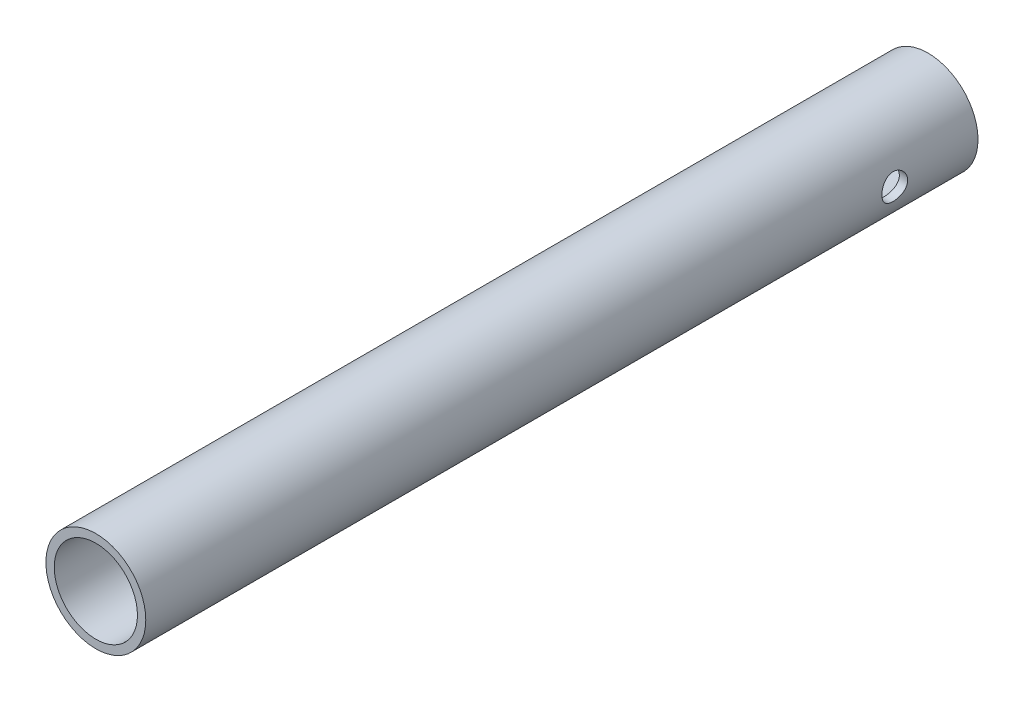
ISO-10303-21;
HEADER;
FILE_DESCRIPTION(('STEP AP214'),'2;1');
FILE_NAME('part.step','',(''),(''),'','','');
FILE_SCHEMA(('AUTOMOTIVE_DESIGN { 1 0 10303 214 1 1 1 1 }'));
ENDSEC;
DATA;
#1=APPLICATION_CONTEXT('core data for automotive mechanical design processes');
#2=APPLICATION_PROTOCOL_DEFINITION('international standard','automotive_design',2000,#1);
#3=PRODUCT_CONTEXT('',#1,'mechanical');
#4=PRODUCT('Part','Part','',(#3));
#5=PRODUCT_RELATED_PRODUCT_CATEGORY('part','',(#4));
#6=PRODUCT_DEFINITION_FORMATION('','',#4);
#7=PRODUCT_DEFINITION_CONTEXT('part definition',#1,'design');
#8=PRODUCT_DEFINITION('design','',#6,#7);
#9=PRODUCT_DEFINITION_SHAPE('','',#8);
#10=(LENGTH_UNIT() NAMED_UNIT(*) SI_UNIT(.MILLI.,.METRE.));
#11=(NAMED_UNIT(*) PLANE_ANGLE_UNIT() SI_UNIT($,.RADIAN.));
#12=(NAMED_UNIT(*) SI_UNIT($,.STERADIAN.) SOLID_ANGLE_UNIT());
#13=UNCERTAINTY_MEASURE_WITH_UNIT(LENGTH_MEASURE(1.E-05),#10,'distance_accuracy_value','');
#14=(GEOMETRIC_REPRESENTATION_CONTEXT(3) GLOBAL_UNCERTAINTY_ASSIGNED_CONTEXT((#13)) GLOBAL_UNIT_ASSIGNED_CONTEXT((#10,
#11,#12)) REPRESENTATION_CONTEXT('',''));
#15=CARTESIAN_POINT('',(0.,0.,0.));
#16=DIRECTION('',(0.,0.,1.));
#17=DIRECTION('',(1.,0.,0.));
#18=AXIS2_PLACEMENT_3D('',#15,#16,#17);
#19=CARTESIAN_POINT('',(0.,0.,-100.));
#20=DIRECTION('',(0.,0.,-1.));
#21=DIRECTION('',(1.,0.,0.));
#22=AXIS2_PLACEMENT_3D('',#19,#20,#21);
#23=PLANE('',#22);
#24=CARTESIAN_POINT('',(0.,0.,-100.));
#25=DIRECTION('',(0.,0.,1.));
#26=DIRECTION('',(1.,0.,0.));
#27=AXIS2_PLACEMENT_3D('',#24,#25,#26);
#28=CIRCLE('',#27,6.);
#29=CARTESIAN_POINT('',(6.,0.,-100.));
#30=VERTEX_POINT('',#29);
#31=EDGE_CURVE('E10',#30,#30,#28,.T.);
#32=ORIENTED_EDGE('',*,*,#31,.F.);
#33=EDGE_LOOP('',(#32));
#34=FACE_BOUND('',#33,.T.);
#35=CARTESIAN_POINT('',(0.,0.,-100.));
#36=DIRECTION('',(0.,0.,1.));
#37=DIRECTION('',(1.,0.,0.));
#38=AXIS2_PLACEMENT_3D('',#35,#36,#37);
#39=CIRCLE('',#38,5.);
#40=CARTESIAN_POINT('',(5.,0.,-100.));
#41=VERTEX_POINT('',#40);
#42=EDGE_CURVE('E67',#41,#41,#39,.T.);
#43=ORIENTED_EDGE('',*,*,#42,.T.);
#44=EDGE_LOOP('',(#43));
#45=FACE_BOUND('',#44,.T.);
#46=ADVANCED_FACE('F45',(#34,#45),#23,.T.);
#47=CARTESIAN_POINT('',(0.,0.,0.));
#48=DIRECTION('',(0.,0.,-1.));
#49=DIRECTION('',(1.,0.,0.));
#50=AXIS2_PLACEMENT_3D('',#47,#48,#49);
#51=PLANE('',#50);
#52=CARTESIAN_POINT('',(0.,0.,0.));
#53=DIRECTION('',(0.,0.,1.));
#54=DIRECTION('',(1.,0.,0.));
#55=AXIS2_PLACEMENT_3D('',#52,#53,#54);
#56=CIRCLE('',#55,6.);
#57=CARTESIAN_POINT('',(6.,0.,0.));
#58=VERTEX_POINT('',#57);
#59=EDGE_CURVE('E60',#58,#58,#56,.T.);
#60=ORIENTED_EDGE('',*,*,#59,.T.);
#61=EDGE_LOOP('',(#60));
#62=FACE_BOUND('',#61,.T.);
#63=CARTESIAN_POINT('',(0.,0.,0.));
#64=DIRECTION('',(0.,0.,1.));
#65=DIRECTION('',(1.,0.,0.));
#66=AXIS2_PLACEMENT_3D('',#63,#64,#65);
#67=CIRCLE('',#66,5.);
#68=CARTESIAN_POINT('',(5.,0.,0.));
#69=VERTEX_POINT('',#68);
#70=EDGE_CURVE('E70',#69,#69,#67,.T.);
#71=ORIENTED_EDGE('',*,*,#70,.F.);
#72=EDGE_LOOP('',(#71));
#73=FACE_BOUND('',#72,.T.);
#74=ADVANCED_FACE('F88',(#62,#73),#51,.F.);
#75=CARTESIAN_POINT('',(0.,0.,-100.));
#76=DIRECTION('',(0.,0.,1.));
#77=DIRECTION('',(-1.,0.,0.));
#78=AXIS2_PLACEMENT_3D('',#75,#76,#77);
#79=CYLINDRICAL_SURFACE('',#78,6.);
#80=CARTESIAN_POINT('',(-6.,0.,-88.45));
#81=CARTESIAN_POINT('',(-5.99999862342204,0.0855443503109014,-88.4500022246847));
#82=CARTESIAN_POINT('',(-5.99815242347884,0.171113037497964,-88.4571055618537));
#83=CARTESIAN_POINT('',(-5.99096665435731,0.339791798517279,-88.4852848725339));
#84=CARTESIAN_POINT('',(-5.98562525272891,0.42290055876631,-88.5063681754818));
#85=CARTESIAN_POINT('',(-5.97203960949649,0.584199755325659,-88.5617810492821));
#86=CARTESIAN_POINT('',(-5.96379898206149,0.662396172966989,-88.5960941330006));
#87=CARTESIAN_POINT('',(-5.94528918762444,0.811923659298571,-88.676932997225));
#88=CARTESIAN_POINT('',(-5.93501991895733,0.883254383649058,-88.7234593898375));
#89=CARTESIAN_POINT('',(-5.91331349844705,1.01858610262265,-88.8284790241086));
#90=CARTESIAN_POINT('',(-5.90185736103427,1.08241550098619,-88.8871894741489));
#91=CARTESIAN_POINT('',(-5.87919241575865,1.19944035779268,-89.0144459626607));
#92=CARTESIAN_POINT('',(-5.86798363784996,1.25263453457501,-89.0829931848632));
#93=CARTESIAN_POINT('',(-5.84688974016224,1.34770055669256,-89.2293281553556));
#94=CARTESIAN_POINT('',(-5.83702865054471,1.38937776494719,-89.3072461293342));
#95=CARTESIAN_POINT('',(-5.82002464160501,1.45897413633046,-89.4692787186205));
#96=CARTESIAN_POINT('',(-5.81288125518578,1.48689566391888,-89.5533922661137));
#97=CARTESIAN_POINT('',(-5.80231702371196,1.52759748721532,-89.7235347079031));
#98=CARTESIAN_POINT('',(-5.7988201353963,1.54068759900813,-89.8094846534676));
#99=CARTESIAN_POINT('',(-5.79571741886674,1.55232047459679,-89.9824262849264));
#100=CARTESIAN_POINT('',(-5.79611091167847,1.55086577684598,-90.0694177863949));
#101=CARTESIAN_POINT('',(-5.80067628829122,1.5336969105417,-90.239577299681));
#102=CARTESIAN_POINT('',(-5.80474960405351,1.51835471262771,-90.3227859041793));
#103=CARTESIAN_POINT('',(-5.81605821715439,1.47444090299208,-90.4854061542923));
#104=CARTESIAN_POINT('',(-5.82329375330479,1.44586829209606,-90.5648175126351));
#105=CARTESIAN_POINT('',(-5.84020013851927,1.37599460918829,-90.718572762389));
#106=CARTESIAN_POINT('',(-5.84989618026752,1.33456080927768,-90.7928534491716));
#107=CARTESIAN_POINT('',(-5.87061719128373,1.24023361109786,-90.9335398124686));
#108=CARTESIAN_POINT('',(-5.88164240732856,1.18733808336582,-90.9999440220678));
#109=CARTESIAN_POINT('',(-5.90419219977471,1.06967440562533,-91.1251209666517));
#110=CARTESIAN_POINT('',(-5.91572174563884,1.00459310648509,-91.1835988444664));
#111=CARTESIAN_POINT('',(-5.93767843378634,0.86540801305535,-91.2888687110179));
#112=CARTESIAN_POINT('',(-5.94810553774123,0.79130390526333,-91.3356602935355));
#113=CARTESIAN_POINT('',(-5.9667402594753,0.635738370807669,-91.4163481440249));
#114=CARTESIAN_POINT('',(-5.97493913584994,0.55424959347617,-91.4501938303863));
#115=CARTESIAN_POINT('',(-5.98813025256303,0.386479280110452,-91.5036222078826));
#116=CARTESIAN_POINT('',(-5.99312314913482,0.300198728837414,-91.5232078180284));
#117=CARTESIAN_POINT('',(-5.99924157949928,0.127812754543026,-91.5471035472045));
#118=CARTESIAN_POINT('',(-6.00046866382196,0.0417664674608004,-91.5518148756922));
#119=CARTESIAN_POINT('',(-5.99920778898859,-0.129885864978107,-91.5469324473486));
#120=CARTESIAN_POINT('',(-5.99672018852505,-0.215491952039896,-91.5373400716928));
#121=CARTESIAN_POINT('',(-5.9883747898563,-0.382421044317184,-91.5044524667519));
#122=CARTESIAN_POINT('',(-5.98257145129857,-0.463790618710358,-91.4813785312785));
#123=CARTESIAN_POINT('',(-5.96825062497589,-0.621498146324928,-91.4224376297302));
#124=CARTESIAN_POINT('',(-5.95973285281969,-0.697835571316152,-91.386569323142));
#125=CARTESIAN_POINT('',(-5.94068733069942,-0.844889791044555,-91.3022967821621));
#126=CARTESIAN_POINT('',(-5.93012502400678,-0.915475042399396,-91.2536710080596));
#127=CARTESIAN_POINT('',(-5.90821252780639,-1.04762556972084,-91.1455446945492));
#128=CARTESIAN_POINT('',(-5.89686219287224,-1.10918917423501,-91.0860421445644));
#129=CARTESIAN_POINT('',(-5.87428332425335,-1.2232207057171,-90.9559835935481));
#130=CARTESIAN_POINT('',(-5.86306587289094,-1.27540635258125,-90.8851777353104));
#131=CARTESIAN_POINT('',(-5.84235399256743,-1.36715789008127,-90.7355795640811));
#132=CARTESIAN_POINT('',(-5.83285948883467,-1.40672432841607,-90.6567875978984));
#133=CARTESIAN_POINT('',(-5.81677568825163,-1.47181700201491,-90.4938644378956));
#134=CARTESIAN_POINT('',(-5.81016933744992,-1.49742588163858,-90.4097680360655));
#135=CARTESIAN_POINT('',(-5.80059922484275,-1.53408420816175,-90.2382648159917));
#136=CARTESIAN_POINT('',(-5.797634601187,-1.54513709992256,-90.1508587860533));
#137=CARTESIAN_POINT('',(-5.7957524331619,-1.55218064333913,-89.9780983966578));
#138=CARTESIAN_POINT('',(-5.79671333306591,-1.54862367749457,-89.8927635199395));
#139=CARTESIAN_POINT('',(-5.80229114732773,-1.5275907316575,-89.7239547182317));
#140=CARTESIAN_POINT('',(-5.80690797832574,-1.51011506902864,-89.6404807508557));
#141=CARTESIAN_POINT('',(-5.81920740859556,-1.46199548278987,-89.4782933026081));
#142=CARTESIAN_POINT('',(-5.82686896487796,-1.43144183551096,-89.3995513307972));
#143=CARTESIAN_POINT('',(-5.84439629140871,-1.35810424265095,-89.2482531661107));
#144=CARTESIAN_POINT('',(-5.85426238745081,-1.31531848910967,-89.1756978897159));
#145=CARTESIAN_POINT('',(-5.87542905575269,-1.2173362725717,-89.0366597352516));
#146=CARTESIAN_POINT('',(-5.88676182878524,-1.16182845549742,-88.9704011423381));
#147=CARTESIAN_POINT('',(-5.90939893254818,-1.04057734031478,-88.847991947321));
#148=CARTESIAN_POINT('',(-5.92070325579735,-0.974831588191537,-88.7918437756436));
#149=CARTESIAN_POINT('',(-5.94227581799358,-0.833407662307709,-88.6901662170085));
#150=CARTESIAN_POINT('',(-5.95251925728994,-0.757559326709026,-88.6448678253352));
#151=CARTESIAN_POINT('',(-5.97054968326495,-0.599064081298698,-88.5677368059487));
#152=CARTESIAN_POINT('',(-5.97833833939723,-0.516421840334339,-88.535895021595));
#153=CARTESIAN_POINT('',(-5.98950082579932,-0.36166962933535,-88.491026753489));
#154=CARTESIAN_POINT('',(-5.99341016806927,-0.290263292208826,-88.4756761805284));
#155=CARTESIAN_POINT('',(-5.99866023146264,-0.145910449520065,-88.4551622943639));
#156=CARTESIAN_POINT('',(-6.00000117413646,-0.0729640773502645,-88.4499981024806));
#157=CARTESIAN_POINT('',(-6.,0.,-88.45));
#158=B_SPLINE_CURVE_WITH_KNOTS('',3,(#80,#81,#82,#83,#84,#85,#86,#87,#88,#89,#90,#91,#92,#93,
#94,#95,#96,#97,#98,#99,#100,#101,#102,#103,#104,#105,#106,#107,#108,#109,#110,#111,#112,#113,
#114,#115,#116,#117,#118,#119,#120,#121,#122,#123,#124,#125,#126,#127,#128,#129,#130,#131,#132,
#133,#134,#135,#136,#137,#138,#139,#140,#141,#142,#143,#144,#145,#146,#147,#148,#149,#150,#151,
#152,#153,#154,#155,#156,#157),.UNSPECIFIED.,.T.,.F.,(4,2,2,2,2,2,2,2,2,2,2,2,2,2,2,2,2,2,2,2,2,
2,2,2,2,2,2,2,2,2,2,2,2,2,2,2,2,2,4),(0.,0.256365570724539,0.512865655545687,0.769047114279872,
1.02524141476863,1.2864705570564,1.54773116136504,1.81316916843509,2.07856153351338,
2.3383015060463,2.59799614788668,2.85093436268057,3.10389168274484,3.35955156797634,
3.61525899278826,3.87877259974275,4.14229536523846,4.40683748579118,4.67132543983076,
4.92861548131815,5.18588068030856,5.43903711917563,5.69222008997015,5.95012990802176,
6.20808744911759,6.47283932841182,6.73757971537991,7.00073502574153,7.26382804582369,
7.51883699534657,7.77384013051371,8.02711068846513,8.28041870031188,8.54075360158111,
8.80115100099258,9.06667852712297,9.33202508117172,9.55070803349449,9.76937212135426),.UNSPECIFIED.);
#159=CARTESIAN_POINT('',(-6.,0.,-88.45));
#160=VERTEX_POINT('',#159);
#161=EDGE_CURVE('E101',#160,#160,#158,.T.);
#162=ORIENTED_EDGE('',*,*,#161,.F.);
#163=EDGE_LOOP('',(#162));
#164=FACE_BOUND('',#163,.T.);
#165=CARTESIAN_POINT('',(6.,0.,-88.45));
#166=CARTESIAN_POINT('',(5.99999862342204,-0.0855443503109007,-88.4500022246847));
#167=CARTESIAN_POINT('',(5.99815242347884,-0.171113037497963,-88.4571055618537));
#168=CARTESIAN_POINT('',(5.99096665435731,-0.339791798517278,-88.4852848725339));
#169=CARTESIAN_POINT('',(5.98562525272891,-0.42290055876631,-88.5063681754818));
#170=CARTESIAN_POINT('',(5.97203960949649,-0.584199755325658,-88.5617810492821));
#171=CARTESIAN_POINT('',(5.96379898206149,-0.662396172966988,-88.5960941330006));
#172=CARTESIAN_POINT('',(5.94528918762444,-0.81192365929857,-88.676932997225));
#173=CARTESIAN_POINT('',(5.93501991895733,-0.883254383649057,-88.7234593898375));
#174=CARTESIAN_POINT('',(5.91331349844705,-1.01858610262265,-88.8284790241086));
#175=CARTESIAN_POINT('',(5.90185736103427,-1.08241550098619,-88.8871894741489));
#176=CARTESIAN_POINT('',(5.87919241575865,-1.19944035779268,-89.0144459626607));
#177=CARTESIAN_POINT('',(5.86798363784996,-1.25263453457501,-89.0829931848632));
#178=CARTESIAN_POINT('',(5.84688974016224,-1.34770055669256,-89.2293281553556));
#179=CARTESIAN_POINT('',(5.83702865054471,-1.38937776494719,-89.3072461293342));
#180=CARTESIAN_POINT('',(5.82002464160501,-1.45897413633045,-89.4692787186205));
#181=CARTESIAN_POINT('',(5.81288125518578,-1.48689566391888,-89.5533922661137));
#182=CARTESIAN_POINT('',(5.80231702371196,-1.52759748721532,-89.7235347079031));
#183=CARTESIAN_POINT('',(5.7988201353963,-1.54068759900812,-89.8094846534676));
#184=CARTESIAN_POINT('',(5.79571741886674,-1.55232047459678,-89.9824262849264));
#185=CARTESIAN_POINT('',(5.79611091167847,-1.55086577684598,-90.0694177863949));
#186=CARTESIAN_POINT('',(5.80067628829122,-1.5336969105417,-90.239577299681));
#187=CARTESIAN_POINT('',(5.80474960405351,-1.5183547126277,-90.3227859041793));
#188=CARTESIAN_POINT('',(5.81605821715439,-1.47444090299208,-90.4854061542923));
#189=CARTESIAN_POINT('',(5.8232937533048,-1.44586829209605,-90.5648175126351));
#190=CARTESIAN_POINT('',(5.84020013851927,-1.37599460918829,-90.718572762389));
#191=CARTESIAN_POINT('',(5.84989618026752,-1.33456080927767,-90.7928534491716));
#192=CARTESIAN_POINT('',(5.87061719128373,-1.24023361109785,-90.9335398124686));
#193=CARTESIAN_POINT('',(5.88164240732856,-1.18733808336581,-90.9999440220678));
#194=CARTESIAN_POINT('',(5.90419219977471,-1.06967440562533,-91.1251209666517));
#195=CARTESIAN_POINT('',(5.91572174563884,-1.00459310648509,-91.1835988444664));
#196=CARTESIAN_POINT('',(5.93767843378635,-0.865408013055348,-91.2888687110179));
#197=CARTESIAN_POINT('',(5.94810553774123,-0.791303905263328,-91.3356602935355));
#198=CARTESIAN_POINT('',(5.9667402594753,-0.635738370807667,-91.4163481440249));
#199=CARTESIAN_POINT('',(5.97493913584994,-0.554249593476168,-91.4501938303863));
#200=CARTESIAN_POINT('',(5.98813025256303,-0.386479280110449,-91.5036222078826));
#201=CARTESIAN_POINT('',(5.99312314913482,-0.300198728837411,-91.5232078180284));
#202=CARTESIAN_POINT('',(5.99924157949929,-0.127812754543022,-91.5471035472045));
#203=CARTESIAN_POINT('',(6.00046866382196,-0.041766467460796,-91.5518148756922));
#204=CARTESIAN_POINT('',(5.99920778898859,0.129885864978112,-91.5469324473486));
#205=CARTESIAN_POINT('',(5.99672018852505,0.2154919520399,-91.5373400716928));
#206=CARTESIAN_POINT('',(5.9883747898563,0.382421044317188,-91.5044524667519));
#207=CARTESIAN_POINT('',(5.98257145129857,0.463790618710362,-91.4813785312785));
#208=CARTESIAN_POINT('',(5.96825062497589,0.621498146324932,-91.4224376297302));
#209=CARTESIAN_POINT('',(5.95973285281969,0.697835571316156,-91.386569323142));
#210=CARTESIAN_POINT('',(5.94068733069941,0.844889791044559,-91.3022967821621));
#211=CARTESIAN_POINT('',(5.93012502400678,0.915475042399398,-91.2536710080596));
#212=CARTESIAN_POINT('',(5.90821252780639,1.04762556972084,-91.1455446945492));
#213=CARTESIAN_POINT('',(5.89686219287224,1.10918917423501,-91.0860421445644));
#214=CARTESIAN_POINT('',(5.87428332425334,1.2232207057171,-90.9559835935481));
#215=CARTESIAN_POINT('',(5.86306587289093,1.27540635258126,-90.8851777353103));
#216=CARTESIAN_POINT('',(5.84235399256743,1.36715789008128,-90.7355795640811));
#217=CARTESIAN_POINT('',(5.83285948883467,1.40672432841608,-90.6567875978984));
#218=CARTESIAN_POINT('',(5.81677568825163,1.47181700201492,-90.4938644378956));
#219=CARTESIAN_POINT('',(5.81016933744992,1.49742588163858,-90.4097680360655));
#220=CARTESIAN_POINT('',(5.80059922484275,1.53408420816175,-90.2382648159917));
#221=CARTESIAN_POINT('',(5.797634601187,1.54513709992256,-90.1508587860533));
#222=CARTESIAN_POINT('',(5.7957524331619,1.55218064333913,-89.9780983966578));
#223=CARTESIAN_POINT('',(5.79671333306591,1.54862367749457,-89.8927635199395));
#224=CARTESIAN_POINT('',(5.80229114732773,1.5275907316575,-89.7239547182317));
#225=CARTESIAN_POINT('',(5.80690797832574,1.51011506902864,-89.6404807508557));
#226=CARTESIAN_POINT('',(5.81920740859556,1.46199548278987,-89.4782933026081));
#227=CARTESIAN_POINT('',(5.82686896487796,1.43144183551096,-89.3995513307972));
#228=CARTESIAN_POINT('',(5.84439629140871,1.35810424265095,-89.2482531661107));
#229=CARTESIAN_POINT('',(5.85426238745081,1.31531848910968,-89.1756978897159));
#230=CARTESIAN_POINT('',(5.87542905575269,1.21733627257171,-89.0366597352516));
#231=CARTESIAN_POINT('',(5.88676182878523,1.16182845549743,-88.9704011423381));
#232=CARTESIAN_POINT('',(5.90939893254818,1.04057734031478,-88.847991947321));
#233=CARTESIAN_POINT('',(5.92070325579735,0.974831588191539,-88.7918437756436));
#234=CARTESIAN_POINT('',(5.94227581799358,0.833407662307711,-88.6901662170085));
#235=CARTESIAN_POINT('',(5.95251925728994,0.757559326709027,-88.6448678253352));
#236=CARTESIAN_POINT('',(5.97054968326495,0.599064081298699,-88.5677368059487));
#237=CARTESIAN_POINT('',(5.97833833939723,0.516421840334341,-88.535895021595));
#238=CARTESIAN_POINT('',(5.98950082579932,0.361669629335351,-88.491026753489));
#239=CARTESIAN_POINT('',(5.99341016806927,0.290263292208827,-88.4756761805284));
#240=CARTESIAN_POINT('',(5.99866023146264,0.145910449520066,-88.4551622943639));
#241=CARTESIAN_POINT('',(6.00000117413646,0.0729640773502654,-88.4499981024806));
#242=CARTESIAN_POINT('',(6.,0.,-88.45));
#243=B_SPLINE_CURVE_WITH_KNOTS('',3,(#165,#166,#167,#168,#169,#170,#171,#172,#173,#174,#175,
#176,#177,#178,#179,#180,#181,#182,#183,#184,#185,#186,#187,#188,#189,#190,#191,#192,#193,#194,
#195,#196,#197,#198,#199,#200,#201,#202,#203,#204,#205,#206,#207,#208,#209,#210,#211,#212,#213,
#214,#215,#216,#217,#218,#219,#220,#221,#222,#223,#224,#225,#226,#227,#228,#229,#230,#231,#232,
#233,#234,#235,#236,#237,#238,#239,#240,#241,#242),.UNSPECIFIED.,.T.,.F.,(4,2,2,2,2,2,2,2,2,2,2,
2,2,2,2,2,2,2,2,2,2,2,2,2,2,2,2,2,2,2,2,2,2,2,2,2,2,2,4),(0.,0.256365570724539,
0.512865655545687,0.769047114279872,1.02524141476863,1.2864705570564,1.54773116136504,
1.81316916843508,2.07856153351338,2.3383015060463,2.59799614788668,2.85093436268057,
3.10389168274485,3.35955156797635,3.61525899278826,3.87877259974275,4.14229536523846,
4.40683748579118,4.67132543983076,4.92861548131815,5.18588068030856,5.43903711917563,
5.69222008997015,5.95012990802176,6.20808744911759,6.47283932841183,6.73757971537992,
7.00073502574152,7.26382804582369,7.51883699534657,7.7738401305137,8.02711068846513,
8.28041870031188,8.54075360158111,8.80115100099258,9.06667852712297,9.33202508117172,
9.55070803349449,9.76937212135426),.UNSPECIFIED.);
#244=CARTESIAN_POINT('',(6.,0.,-88.45));
#245=VERTEX_POINT('',#244);
#246=EDGE_CURVE('E106',#245,#245,#243,.T.);
#247=ORIENTED_EDGE('',*,*,#246,.F.);
#248=EDGE_LOOP('',(#247));
#249=FACE_BOUND('',#248,.T.);
#250=ORIENTED_EDGE('',*,*,#31,.T.);
#251=EDGE_LOOP('',(#250));
#252=FACE_BOUND('',#251,.T.);
#253=ORIENTED_EDGE('',*,*,#59,.F.);
#254=EDGE_LOOP('',(#253));
#255=FACE_BOUND('',#254,.T.);
#256=ADVANCED_FACE('F47',(#164,#249,#252,#255),#79,.T.);
#257=CARTESIAN_POINT('',(0.,0.,-100.));
#258=DIRECTION('',(0.,0.,1.));
#259=DIRECTION('',(-1.,0.,0.));
#260=AXIS2_PLACEMENT_3D('',#257,#258,#259);
#261=CYLINDRICAL_SURFACE('',#260,5.);
#262=CARTESIAN_POINT('',(-5.,0.,-91.55));
#263=CARTESIAN_POINT('',(-4.99999951036779,-0.0848984604279463,-91.5499993457353));
#264=CARTESIAN_POINT('',(-4.99781721187509,-0.169803668342381,-91.5430017456515));
#265=CARTESIAN_POINT('',(-4.98932527207252,-0.337133220777893,-91.5152681888394));
#266=CARTESIAN_POINT('',(-4.98301463670185,-0.419556962786359,-91.4945289232447));
#267=CARTESIAN_POINT('',(-4.96695583698883,-0.579486364639225,-91.4400770879927));
#268=CARTESIAN_POINT('',(-4.9572129451353,-0.656999353904881,-91.4063844096165));
#269=CARTESIAN_POINT('',(-4.93529695244565,-0.805275561821531,-91.3270661701357));
#270=CARTESIAN_POINT('',(-4.923123480586,-0.876037747534827,-91.2814387868906));
#271=CARTESIAN_POINT('',(-4.89722526714626,-1.01095832875082,-91.178083745763));
#272=CARTESIAN_POINT('',(-4.88346713124333,-1.07488231229008,-91.1200584818205));
#273=CARTESIAN_POINT('',(-4.85614480692875,-1.19226552074319,-90.994188595476));
#274=CARTESIAN_POINT('',(-4.84258065431989,-1.24572283638974,-90.9263421854778));
#275=CARTESIAN_POINT('',(-4.81682477265869,-1.34191867293835,-90.7807359180547));
#276=CARTESIAN_POINT('',(-4.8046743175935,-1.38436572096407,-90.7027755047959));
#277=CARTESIAN_POINT('',(-4.78362317675618,-1.45544961933946,-90.5403853197357));
#278=CARTESIAN_POINT('',(-4.77472165054594,-1.48409004182491,-90.4559572278506));
#279=CARTESIAN_POINT('',(-4.76152527274791,-1.52589247703498,-90.2856708832015));
#280=CARTESIAN_POINT('',(-4.75710149871766,-1.53948878696477,-90.1999295101026));
#281=CARTESIAN_POINT('',(-4.75297857101368,-1.55217372132493,-90.0272773053626));
#282=CARTESIAN_POINT('',(-4.75327818418307,-1.55126613235545,-89.9403667848763));
#283=CARTESIAN_POINT('',(-4.75845428577028,-1.53530900350483,-89.7714234192704));
#284=CARTESIAN_POINT('',(-4.76315261879823,-1.52080991327079,-89.6893322083147));
#285=CARTESIAN_POINT('',(-4.77630760142625,-1.4789731992563,-89.5288102098725));
#286=CARTESIAN_POINT('',(-4.78476464464349,-1.45163423084961,-89.4503798067016));
#287=CARTESIAN_POINT('',(-4.80462183036644,-1.38450171199553,-89.2980873784582));
#288=CARTESIAN_POINT('',(-4.81606267263906,-1.34453416997655,-89.2243075855177));
#289=CARTESIAN_POINT('',(-4.84057952939702,-1.25339989003565,-89.0843205979565));
#290=CARTESIAN_POINT('',(-4.85365596256883,-1.2022302820293,-89.0181153506433));
#291=CARTESIAN_POINT('',(-4.88068691421537,-1.0874366726901,-88.8920427891873));
#292=CARTESIAN_POINT('',(-4.89465453918909,-1.02335776870629,-88.8325917382629));
#293=CARTESIAN_POINT('',(-4.92137742235268,-0.885965810322411,-88.7251790606602));
#294=CARTESIAN_POINT('',(-4.93413259352141,-0.812652093991181,-88.6772182582937));
#295=CARTESIAN_POINT('',(-4.95712370655291,-0.658078685457114,-88.5938714525739));
#296=CARTESIAN_POINT('',(-4.96733986015102,-0.576763076811203,-88.5585833239354));
#297=CARTESIAN_POINT('',(-4.98395906682503,-0.408959843162271,-88.5023096129635));
#298=CARTESIAN_POINT('',(-4.99036325845885,-0.32247377097623,-88.4813197597463));
#299=CARTESIAN_POINT('',(-4.99845438764376,-0.150319074279245,-88.4549442460458));
#300=CARTESIAN_POINT('',(-5.00031163429244,-0.0647446827565117,-88.4489949385412));
#301=CARTESIAN_POINT('',(-4.99960248750333,0.106188109515854,-88.451282099157));
#302=CARTESIAN_POINT('',(-4.99703672887713,0.19154653950048,-88.4595165315567));
#303=CARTESIAN_POINT('',(-4.98788169118652,0.357459797333221,-88.4894842542252));
#304=CARTESIAN_POINT('',(-4.9813920802339,0.438081008945539,-88.510883381609));
#305=CARTESIAN_POINT('',(-4.96514689632701,0.594567232233527,-88.5661664630471));
#306=CARTESIAN_POINT('',(-4.95539092201505,0.670431658053576,-88.6000519514272));
#307=CARTESIAN_POINT('',(-4.93332471675189,0.817286858698628,-88.6802610005194));
#308=CARTESIAN_POINT('',(-4.92095852072226,0.88811581324431,-88.726865020704));
#309=CARTESIAN_POINT('',(-4.89508710334594,1.02113752532934,-88.8308508657841));
#310=CARTESIAN_POINT('',(-4.88158157830333,1.08332796844852,-88.8882355693777));
#311=CARTESIAN_POINT('',(-4.85429209347264,1.19982105818673,-89.0148044487681));
#312=CARTESIAN_POINT('',(-4.84051777932991,1.25372210260317,-89.0843611689143));
#313=CARTESIAN_POINT('',(-4.8148023151216,1.3491213184623,-89.2318317977621));
#314=CARTESIAN_POINT('',(-4.80286113172644,1.39061971542026,-89.309745554474));
#315=CARTESIAN_POINT('',(-4.78229760560468,1.45977182503441,-89.4715386379018));
#316=CARTESIAN_POINT('',(-4.77366186434556,1.48748156983816,-89.5553922124186));
#317=CARTESIAN_POINT('',(-4.76075522394672,1.5282920920436,-89.7268966862659));
#318=CARTESIAN_POINT('',(-4.75648269800308,1.54139831446475,-89.8145461575994));
#319=CARTESIAN_POINT('',(-4.75295389387883,1.55224290370566,-89.9869614568471));
#320=CARTESIAN_POINT('',(-4.75348283682889,1.550639237088,-90.0716820215119));
#321=CARTESIAN_POINT('',(-4.75897670483196,1.53369431627937,-90.2395839927435));
#322=CARTESIAN_POINT('',(-4.76394142908372,1.51835368394045,-90.3227654688086));
#323=CARTESIAN_POINT('',(-4.77759858050366,1.47480761637235,-90.484072031623));
#324=CARTESIAN_POINT('',(-4.78623717549533,1.4467876029516,-90.5622520750944));
#325=CARTESIAN_POINT('',(-4.80625573394825,1.37882379723991,-90.7128636908133));
#326=CARTESIAN_POINT('',(-4.81763624850405,1.33887760753708,-90.785294103555));
#327=CARTESIAN_POINT('',(-4.84240420312915,1.24639244761275,-90.925375012139));
#328=CARTESIAN_POINT('',(-4.85585213290258,1.1934270921622,-90.9927332787408));
#329=CARTESIAN_POINT('',(-4.88295838962449,1.07716085006951,-91.1178188760105));
#330=CARTESIAN_POINT('',(-4.89661677162082,1.01385721621445,-91.1755436384804));
#331=CARTESIAN_POINT('',(-4.92312838994156,0.876277521882481,-91.2815680774942));
#332=CARTESIAN_POINT('',(-4.93594196348224,0.801715529938181,-91.3295077292466));
#333=CARTESIAN_POINT('',(-4.9588270762312,0.645193474141633,-91.4121075500023));
#334=CARTESIAN_POINT('',(-4.96889973502191,0.56323644921216,-91.4467731434281));
#335=CARTESIAN_POINT('',(-4.98442975017195,0.40179655160623,-91.4992026724845));
#336=CARTESIAN_POINT('',(-4.99021839691233,0.322744010256349,-91.5181974634066));
#337=CARTESIAN_POINT('',(-4.99800338668134,0.162462753769385,-91.5435952136464));
#338=CARTESIAN_POINT('',(-5.00000046850097,0.0812344657079259,-91.5500006260284));
#339=CARTESIAN_POINT('',(-5.,0.,-91.55));
#340=B_SPLINE_CURVE_WITH_KNOTS('',3,(#262,#263,#264,#265,#266,#267,#268,#269,#270,#271,#272,
#273,#274,#275,#276,#277,#278,#279,#280,#281,#282,#283,#284,#285,#286,#287,#288,#289,#290,#291,
#292,#293,#294,#295,#296,#297,#298,#299,#300,#301,#302,#303,#304,#305,#306,#307,#308,#309,#310,
#311,#312,#313,#314,#315,#316,#317,#318,#319,#320,#321,#322,#323,#324,#325,#326,#327,#328,#329,
#330,#331,#332,#333,#334,#335,#336,#337,#338,#339),.UNSPECIFIED.,.T.,.F.,(4,2,2,2,2,2,2,2,2,2,2,
2,2,2,2,2,2,2,2,2,2,2,2,2,2,2,2,2,2,2,2,2,2,2,2,2,2,2,4),(0.,0.254396830193013,
0.508854939067414,0.762923852397209,1.01703157856677,1.27811016261802,1.53923632679228,
1.80669687701853,2.07408819100383,2.33354085793619,2.59292578946427,2.84223973015721,
3.09157978549386,3.34451706133851,3.59751921831481,3.86184447125797,4.12618868125027,
4.39253268700392,4.65879710108143,4.91492451484354,5.17101517099383,5.42085927295125,
5.67073408602785,5.92663973952147,6.18261382326727,6.44855856503466,6.71449847087905,
6.97934868222448,7.24410010934582,7.49706915491486,7.75002674952944,7.99939903495251,
8.24882148323297,8.50786697268708,8.76698141119865,9.03437391807994,9.3016570385348,
9.54512221360272,9.78853994431714),.UNSPECIFIED.);
#341=CARTESIAN_POINT('',(-5.,0.,-91.55));
#342=VERTEX_POINT('',#341);
#343=EDGE_CURVE('E50',#342,#342,#340,.T.);
#344=ORIENTED_EDGE('',*,*,#343,.T.);
#345=EDGE_LOOP('',(#344));
#346=FACE_BOUND('',#345,.T.);
#347=CARTESIAN_POINT('',(5.,0.,-88.45));
#348=CARTESIAN_POINT('',(4.99999951036779,-0.0848984604279455,-88.4500006542647));
#349=CARTESIAN_POINT('',(4.99781721187509,-0.16980366834238,-88.4569982543485));
#350=CARTESIAN_POINT('',(4.98932527207252,-0.337133220777892,-88.4847318111607));
#351=CARTESIAN_POINT('',(4.98301463670185,-0.419556962786358,-88.5054710767553));
#352=CARTESIAN_POINT('',(4.96695583698883,-0.579486364639224,-88.5599229120073));
#353=CARTESIAN_POINT('',(4.9572129451353,-0.656999353904881,-88.5936155903835));
#354=CARTESIAN_POINT('',(4.93529695244566,-0.805275561821531,-88.6729338298643));
#355=CARTESIAN_POINT('',(4.923123480586,-0.876037747534827,-88.7185612131094));
#356=CARTESIAN_POINT('',(4.89722526714626,-1.01095832875082,-88.821916254237));
#357=CARTESIAN_POINT('',(4.88346713124333,-1.07488231229008,-88.8799415181796));
#358=CARTESIAN_POINT('',(4.85614480692875,-1.19226552074319,-89.005811404524));
#359=CARTESIAN_POINT('',(4.84258065431989,-1.24572283638974,-89.0736578145222));
#360=CARTESIAN_POINT('',(4.81682477265869,-1.34191867293835,-89.2192640819453));
#361=CARTESIAN_POINT('',(4.8046743175935,-1.38436572096407,-89.2972244952041));
#362=CARTESIAN_POINT('',(4.78362317675618,-1.45544961933946,-89.4596146802644));
#363=CARTESIAN_POINT('',(4.77472165054594,-1.48409004182491,-89.5440427721495));
#364=CARTESIAN_POINT('',(4.76152527274791,-1.52589247703498,-89.7143291167986));
#365=CARTESIAN_POINT('',(4.75710149871766,-1.53948878696477,-89.8000704898974));
#366=CARTESIAN_POINT('',(4.75297857101368,-1.55217372132493,-89.9727226946374));
#367=CARTESIAN_POINT('',(4.75327818418307,-1.55126613235545,-90.0596332151237));
#368=CARTESIAN_POINT('',(4.75845428577028,-1.53530900350483,-90.2285765807296));
#369=CARTESIAN_POINT('',(4.76315261879823,-1.52080991327079,-90.3106677916853));
#370=CARTESIAN_POINT('',(4.77630760142625,-1.4789731992563,-90.4711897901275));
#371=CARTESIAN_POINT('',(4.78476464464349,-1.4516342308496,-90.5496201932984));
#372=CARTESIAN_POINT('',(4.80462183036644,-1.38450171199553,-90.7019126215418));
#373=CARTESIAN_POINT('',(4.81606267263906,-1.34453416997655,-90.7756924144824));
#374=CARTESIAN_POINT('',(4.84057952939702,-1.25339989003565,-90.9156794020436));
#375=CARTESIAN_POINT('',(4.85365596256883,-1.2022302820293,-90.9818846493567));
#376=CARTESIAN_POINT('',(4.88068691421537,-1.08743667269011,-91.1079572108127));
#377=CARTESIAN_POINT('',(4.89465453918908,-1.02335776870629,-91.1674082617371));
#378=CARTESIAN_POINT('',(4.92137742235267,-0.885965810322421,-91.2748209393398));
#379=CARTESIAN_POINT('',(4.93413259352141,-0.812652093991192,-91.3227817417063));
#380=CARTESIAN_POINT('',(4.95712370655291,-0.658078685457128,-91.4061285474261));
#381=CARTESIAN_POINT('',(4.96733986015102,-0.576763076811218,-91.4414166760647));
#382=CARTESIAN_POINT('',(4.98395906682503,-0.408959843162282,-91.4976903870365));
#383=CARTESIAN_POINT('',(4.99036325845885,-0.322473770976236,-91.5186802402537));
#384=CARTESIAN_POINT('',(4.99845438764376,-0.150319074279245,-91.5450557539543));
#385=CARTESIAN_POINT('',(5.00031163429244,-0.0647446827565126,-91.5510050614588));
#386=CARTESIAN_POINT('',(4.99960248750333,0.106188109515853,-91.548717900843));
#387=CARTESIAN_POINT('',(4.99703672887713,0.19154653950048,-91.5404834684434));
#388=CARTESIAN_POINT('',(4.98788169118652,0.357459797333222,-91.5105157457748));
#389=CARTESIAN_POINT('',(4.9813920802339,0.438081008945539,-91.489116618391));
#390=CARTESIAN_POINT('',(4.96514689632701,0.594567232233527,-91.4338335369529));
#391=CARTESIAN_POINT('',(4.95539092201505,0.670431658053576,-91.3999480485729));
#392=CARTESIAN_POINT('',(4.93332471675189,0.817286858698629,-91.3197389994806));
#393=CARTESIAN_POINT('',(4.92095852072226,0.88811581324431,-91.2731349792961));
#394=CARTESIAN_POINT('',(4.89508710334594,1.02113752532934,-91.169149134216));
#395=CARTESIAN_POINT('',(4.88158157830333,1.08332796844852,-91.1117644306223));
#396=CARTESIAN_POINT('',(4.85429209347264,1.19982105818673,-90.9851955512319));
#397=CARTESIAN_POINT('',(4.84051777932991,1.25372210260317,-90.9156388310857));
#398=CARTESIAN_POINT('',(4.8148023151216,1.34912131846231,-90.7681682022379));
#399=CARTESIAN_POINT('',(4.80286113172644,1.39061971542026,-90.690254445526));
#400=CARTESIAN_POINT('',(4.78229760560468,1.45977182503441,-90.5284613620983));
#401=CARTESIAN_POINT('',(4.77366186434556,1.48748156983815,-90.4446077875815));
#402=CARTESIAN_POINT('',(4.76075522394672,1.5282920920436,-90.2731033137341));
#403=CARTESIAN_POINT('',(4.75648269800308,1.54139831446475,-90.1854538424006));
#404=CARTESIAN_POINT('',(4.75295389387883,1.55224290370566,-90.0130385431529));
#405=CARTESIAN_POINT('',(4.75348283682889,1.550639237088,-89.9283179784881));
#406=CARTESIAN_POINT('',(4.75897670483196,1.53369431627937,-89.7604160072565));
#407=CARTESIAN_POINT('',(4.76394142908372,1.51835368394045,-89.6772345311914));
#408=CARTESIAN_POINT('',(4.77759858050366,1.47480761637235,-89.5159279683771));
#409=CARTESIAN_POINT('',(4.78623717549533,1.4467876029516,-89.4377479249057));
#410=CARTESIAN_POINT('',(4.80625573394825,1.37882379723991,-89.2871363091867));
#411=CARTESIAN_POINT('',(4.81763624850405,1.33887760753708,-89.2147058964451));
#412=CARTESIAN_POINT('',(4.84240420312915,1.24639244761275,-89.074624987861));
#413=CARTESIAN_POINT('',(4.85585213290257,1.1934270921622,-89.0072667212592));
#414=CARTESIAN_POINT('',(4.88295838962449,1.07716085006951,-88.8821811239895));
#415=CARTESIAN_POINT('',(4.89661677162082,1.01385721621445,-88.8244563615196));
#416=CARTESIAN_POINT('',(4.92312838994156,0.876277521882479,-88.7184319225058));
#417=CARTESIAN_POINT('',(4.93594196348224,0.801715529938179,-88.6704922707534));
#418=CARTESIAN_POINT('',(4.9588270762312,0.64519347414163,-88.5878924499977));
#419=CARTESIAN_POINT('',(4.96889973502191,0.563236449212157,-88.5532268565719));
#420=CARTESIAN_POINT('',(4.98442975017195,0.401796551606229,-88.5007973275155));
#421=CARTESIAN_POINT('',(4.99021839691233,0.322744010256349,-88.4818025365935));
#422=CARTESIAN_POINT('',(4.99800338668134,0.162462753769386,-88.4564047863536));
#423=CARTESIAN_POINT('',(5.00000046850097,0.0812344657079267,-88.4499993739717));
#424=CARTESIAN_POINT('',(5.,0.,-88.45));
#425=B_SPLINE_CURVE_WITH_KNOTS('',3,(#347,#348,#349,#350,#351,#352,#353,#354,#355,#356,#357,
#358,#359,#360,#361,#362,#363,#364,#365,#366,#367,#368,#369,#370,#371,#372,#373,#374,#375,#376,
#377,#378,#379,#380,#381,#382,#383,#384,#385,#386,#387,#388,#389,#390,#391,#392,#393,#394,#395,
#396,#397,#398,#399,#400,#401,#402,#403,#404,#405,#406,#407,#408,#409,#410,#411,#412,#413,#414,
#415,#416,#417,#418,#419,#420,#421,#422,#423,#424),.UNSPECIFIED.,.T.,.F.,(4,2,2,2,2,2,2,2,2,2,2,
2,2,2,2,2,2,2,2,2,2,2,2,2,2,2,2,2,2,2,2,2,2,2,2,2,2,2,4),(0.,0.254396830193013,
0.508854939067414,0.76292385239721,1.01703157856677,1.27811016261802,1.53923632679228,
1.80669687701855,2.07408819100383,2.33354085793619,2.59292578946427,2.84223973015721,
3.09157978549386,3.34451706133851,3.59751921831481,3.86184447125796,4.12618868125025,
4.39253268700391,4.65879710108143,4.91492451484354,5.17101517099383,5.42085927295126,
5.67073408602785,5.92663973952147,6.18261382326727,6.44855856503467,6.71449847087905,
6.97934868222447,7.24410010934582,7.49706915491486,7.75002674952944,7.99939903495251,
8.24882148323297,8.50786697268708,8.76698141119865,9.03437391807996,9.3016570385348,
9.54512221360272,9.78853994431715),.UNSPECIFIED.);
#426=CARTESIAN_POINT('',(5.,0.,-88.45));
#427=VERTEX_POINT('',#426);
#428=EDGE_CURVE('E72',#427,#427,#425,.T.);
#429=ORIENTED_EDGE('',*,*,#428,.T.);
#430=EDGE_LOOP('',(#429));
#431=FACE_BOUND('',#430,.T.);
#432=ORIENTED_EDGE('',*,*,#42,.F.);
#433=EDGE_LOOP('',(#432));
#434=FACE_BOUND('',#433,.T.);
#435=ORIENTED_EDGE('',*,*,#70,.T.);
#436=EDGE_LOOP('',(#435));
#437=FACE_BOUND('',#436,.T.);
#438=ADVANCED_FACE('F80',(#346,#431,#434,#437),#261,.F.);
#439=CARTESIAN_POINT('',(-6.,0.,-90.));
#440=DIRECTION('',(1.,0.,0.));
#441=DIRECTION('',(0.,0.,1.));
#442=AXIS2_PLACEMENT_3D('',#439,#440,#441);
#443=CYLINDRICAL_SURFACE('',#442,1.54999999999999);
#444=ORIENTED_EDGE('',*,*,#428,.F.);
#445=EDGE_LOOP('',(#444));
#446=FACE_BOUND('',#445,.T.);
#447=ORIENTED_EDGE('',*,*,#246,.T.);
#448=EDGE_LOOP('',(#447));
#449=FACE_BOUND('',#448,.T.);
#450=ADVANCED_FACE('F84',(#446,#449),#443,.F.);
#451=ORIENTED_EDGE('',*,*,#343,.F.);
#452=EDGE_LOOP('',(#451));
#453=FACE_BOUND('',#452,.T.);
#454=ORIENTED_EDGE('',*,*,#161,.T.);
#455=EDGE_LOOP('',(#454));
#456=FACE_BOUND('',#455,.T.);
#457=ADVANCED_FACE('F78',(#453,#456),#443,.F.);
#458=CLOSED_SHELL('',(#46,#74,#256,#438,#450,#457));
#459=MANIFOLD_SOLID_BREP('B2',#458);
#460=ADVANCED_BREP_SHAPE_REPRESENTATION('',(#18,#459),#14);
#461=SHAPE_DEFINITION_REPRESENTATION(#9,#460);
ENDSEC;
END-ISO-10303-21;
